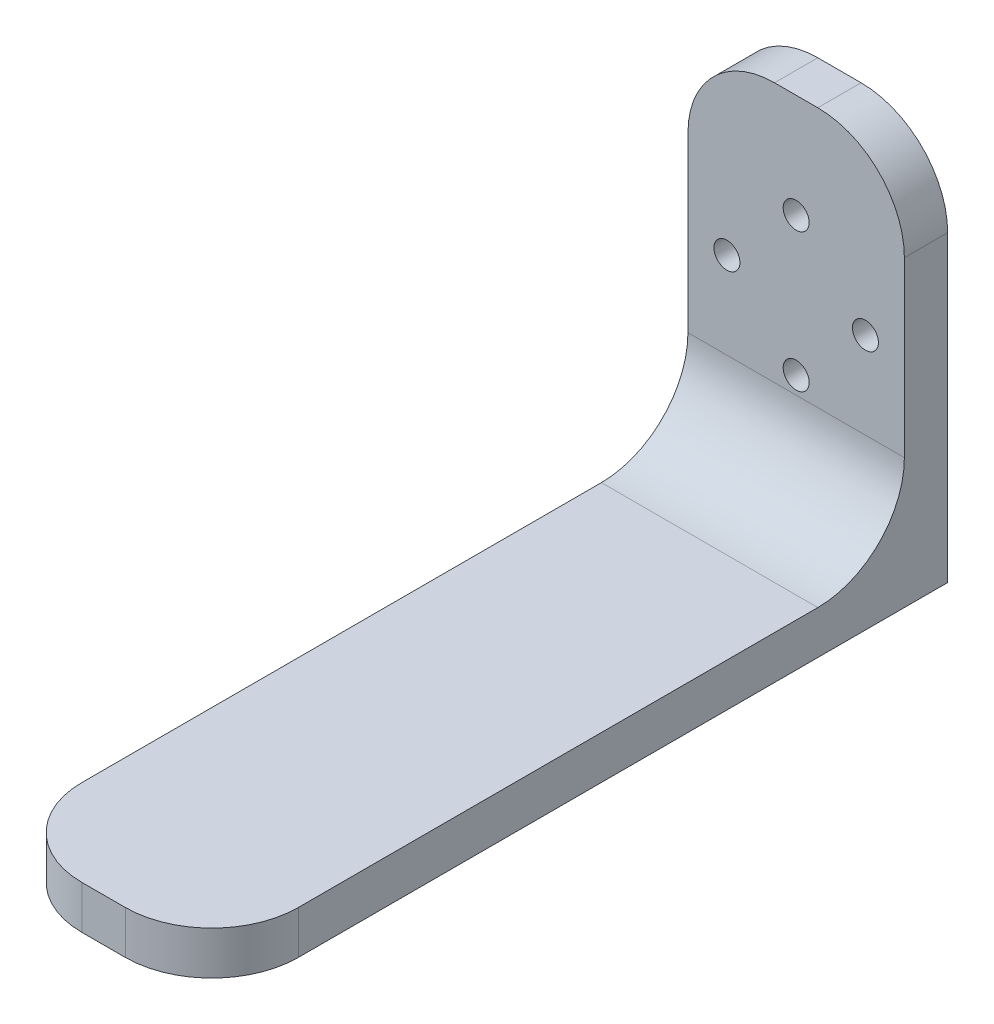
ISO-10303-21;
HEADER;
FILE_DESCRIPTION(('STEP AP214'),'2;1');
FILE_NAME('part.step','',(''),(''),'','','');
FILE_SCHEMA(('AUTOMOTIVE_DESIGN { 1 0 10303 214 1 1 1 1 }'));
ENDSEC;
DATA;
#1=APPLICATION_CONTEXT('core data for automotive mechanical design processes');
#2=APPLICATION_PROTOCOL_DEFINITION('international standard','automotive_design',2000,#1);
#3=PRODUCT_CONTEXT('',#1,'mechanical');
#4=PRODUCT('Part','Part','',(#3));
#5=PRODUCT_RELATED_PRODUCT_CATEGORY('part','',(#4));
#6=PRODUCT_DEFINITION_FORMATION('','',#4);
#7=PRODUCT_DEFINITION_CONTEXT('part definition',#1,'design');
#8=PRODUCT_DEFINITION('design','',#6,#7);
#9=PRODUCT_DEFINITION_SHAPE('','',#8);
#10=(LENGTH_UNIT() NAMED_UNIT(*) SI_UNIT(.MILLI.,.METRE.));
#11=(NAMED_UNIT(*) PLANE_ANGLE_UNIT() SI_UNIT($,.RADIAN.));
#12=(NAMED_UNIT(*) SI_UNIT($,.STERADIAN.) SOLID_ANGLE_UNIT());
#13=UNCERTAINTY_MEASURE_WITH_UNIT(LENGTH_MEASURE(1.E-05),#10,'distance_accuracy_value','');
#14=(GEOMETRIC_REPRESENTATION_CONTEXT(3) GLOBAL_UNCERTAINTY_ASSIGNED_CONTEXT((#13)) GLOBAL_UNIT_ASSIGNED_CONTEXT((#10,
#11,#12)) REPRESENTATION_CONTEXT('',''));
#15=CARTESIAN_POINT('',(0.,0.,0.));
#16=DIRECTION('',(0.,0.,1.));
#17=DIRECTION('',(1.,0.,0.));
#18=AXIS2_PLACEMENT_3D('',#15,#16,#17);
#19=CARTESIAN_POINT('',(0.,0.,5.));
#20=DIRECTION('',(0.,0.,1.));
#21=DIRECTION('',(1.,0.,0.));
#22=AXIS2_PLACEMENT_3D('',#19,#20,#21);
#23=PLANE('',#22);
#24=CARTESIAN_POINT('',(4.50480562578407E-13,-8.,5.));
#25=DIRECTION('',(0.,0.,1.));
#26=DIRECTION('',(1.,0.,0.));
#27=AXIS2_PLACEMENT_3D('',#24,#25,#26);
#28=CIRCLE('',#27,1.50000000000048);
#29=CARTESIAN_POINT('',(1.50000000000093,-8.,5.));
#30=VERTEX_POINT('',#29);
#31=EDGE_CURVE('E163',#30,#30,#28,.T.);
#32=ORIENTED_EDGE('',*,*,#31,.F.);
#33=EDGE_LOOP('',(#32));
#34=FACE_BOUND('',#33,.T.);
#35=CARTESIAN_POINT('',(0.,8.,5.));
#36=DIRECTION('',(0.,0.,1.));
#37=DIRECTION('',(1.,0.,0.));
#38=AXIS2_PLACEMENT_3D('',#35,#36,#37);
#39=CIRCLE('',#38,1.5);
#40=CARTESIAN_POINT('',(1.5,8.,5.));
#41=VERTEX_POINT('',#40);
#42=EDGE_CURVE('E137',#41,#41,#39,.T.);
#43=ORIENTED_EDGE('',*,*,#42,.F.);
#44=EDGE_LOOP('',(#43));
#45=FACE_BOUND('',#44,.T.);
#46=DIRECTION('',(0.,1.,0.));
#47=VECTOR('',#46,1.);
#48=CARTESIAN_POINT('',(12.5,-20.,5.));
#49=LINE('',#48,#47);
#50=CARTESIAN_POINT('',(12.5,-10.,5.));
#51=VERTEX_POINT('',#50);
#52=CARTESIAN_POINT('',(12.5,9.99999999999999,5.));
#53=VERTEX_POINT('',#52);
#54=EDGE_CURVE('E182',#51,#53,#49,.T.);
#55=ORIENTED_EDGE('',*,*,#54,.T.);
#56=CARTESIAN_POINT('',(2.5,10.,5.));
#57=DIRECTION('',(0.,0.,1.));
#58=DIRECTION('',(1.,0.,0.));
#59=AXIS2_PLACEMENT_3D('',#56,#57,#58);
#60=CIRCLE('',#59,10.);
#61=CARTESIAN_POINT('',(2.5,20.,5.));
#62=VERTEX_POINT('',#61);
#63=EDGE_CURVE('E210',#53,#62,#60,.T.);
#64=ORIENTED_EDGE('',*,*,#63,.T.);
#65=DIRECTION('',(-1.,0.,0.));
#66=VECTOR('',#65,1.);
#67=CARTESIAN_POINT('',(12.5,20.,5.));
#68=LINE('',#67,#66);
#69=CARTESIAN_POINT('',(-2.5,20.,5.));
#70=VERTEX_POINT('',#69);
#71=EDGE_CURVE('E186',#62,#70,#68,.T.);
#72=ORIENTED_EDGE('',*,*,#71,.T.);
#73=CARTESIAN_POINT('',(-2.5,9.99999999999999,5.));
#74=DIRECTION('',(0.,0.,1.));
#75=DIRECTION('',(1.,0.,0.));
#76=AXIS2_PLACEMENT_3D('',#73,#74,#75);
#77=CIRCLE('',#76,10.);
#78=CARTESIAN_POINT('',(-12.5,9.99999999999999,5.));
#79=VERTEX_POINT('',#78);
#80=EDGE_CURVE('E208',#70,#79,#77,.T.);
#81=ORIENTED_EDGE('',*,*,#80,.T.);
#82=DIRECTION('',(0.,-1.,0.));
#83=VECTOR('',#82,1.);
#84=CARTESIAN_POINT('',(-12.5,-20.,5.));
#85=LINE('',#84,#83);
#86=CARTESIAN_POINT('',(-12.5,-10.,5.));
#87=VERTEX_POINT('',#86);
#88=EDGE_CURVE('E179',#79,#87,#85,.T.);
#89=ORIENTED_EDGE('',*,*,#88,.T.);
#90=DIRECTION('',(1.,0.,0.));
#91=VECTOR('',#90,1.);
#92=CARTESIAN_POINT('',(12.5,-10.,5.));
#93=LINE('',#92,#91);
#94=EDGE_CURVE('E205',#87,#51,#93,.T.);
#95=ORIENTED_EDGE('',*,*,#94,.T.);
#96=EDGE_LOOP('',(#55,#64,#72,#81,#89,#95));
#97=FACE_BOUND('',#96,.T.);
#98=CARTESIAN_POINT('',(8.,0.,5.));
#99=DIRECTION('',(0.,0.,1.));
#100=DIRECTION('',(1.,0.,0.));
#101=AXIS2_PLACEMENT_3D('',#98,#99,#100);
#102=CIRCLE('',#101,1.5);
#103=CARTESIAN_POINT('',(9.5,0.,5.));
#104=VERTEX_POINT('',#103);
#105=EDGE_CURVE('E169',#104,#104,#102,.T.);
#106=ORIENTED_EDGE('',*,*,#105,.F.);
#107=EDGE_LOOP('',(#106));
#108=FACE_BOUND('',#107,.T.);
#109=CARTESIAN_POINT('',(-7.99999999999977,-2.25828254681354E-13,5.));
#110=DIRECTION('',(0.,0.,1.));
#111=DIRECTION('',(1.,0.,0.));
#112=AXIS2_PLACEMENT_3D('',#109,#110,#111);
#113=CIRCLE('',#112,1.50000000000036);
#114=CARTESIAN_POINT('',(-6.49999999999941,-2.25828254681354E-13,5.));
#115=VERTEX_POINT('',#114);
#116=EDGE_CURVE('E157',#115,#115,#113,.T.);
#117=ORIENTED_EDGE('',*,*,#116,.F.);
#118=EDGE_LOOP('',(#117));
#119=FACE_BOUND('',#118,.T.);
#120=ADVANCED_FACE('F32',(#34,#45,#97,#108,#119),#23,.T.);
#121=CARTESIAN_POINT('',(0.,0.,0.));
#122=DIRECTION('',(0.,0.,1.));
#123=DIRECTION('',(1.,0.,0.));
#124=AXIS2_PLACEMENT_3D('',#121,#122,#123);
#125=PLANE('',#124);
#126=DIRECTION('',(-1.,0.,0.));
#127=VECTOR('',#126,1.);
#128=CARTESIAN_POINT('',(12.5,20.,0.));
#129=LINE('',#128,#127);
#130=CARTESIAN_POINT('',(2.5,20.,0.));
#131=VERTEX_POINT('',#130);
#132=CARTESIAN_POINT('',(-2.5,20.,0.));
#133=VERTEX_POINT('',#132);
#134=EDGE_CURVE('E183',#131,#133,#129,.T.);
#135=ORIENTED_EDGE('',*,*,#134,.F.);
#136=CARTESIAN_POINT('',(2.5,10.,0.));
#137=DIRECTION('',(0.,0.,1.));
#138=DIRECTION('',(1.,0.,0.));
#139=AXIS2_PLACEMENT_3D('',#136,#137,#138);
#140=CIRCLE('',#139,10.);
#141=CARTESIAN_POINT('',(12.5,9.99999999999999,0.));
#142=VERTEX_POINT('',#141);
#143=EDGE_CURVE('E199',#131,#142,#140,.F.);
#144=ORIENTED_EDGE('',*,*,#143,.T.);
#145=DIRECTION('',(0.,1.,0.));
#146=VECTOR('',#145,1.);
#147=CARTESIAN_POINT('',(12.5,-20.,0.));
#148=LINE('',#147,#146);
#149=CARTESIAN_POINT('',(12.5,-25.,0.));
#150=VERTEX_POINT('',#149);
#151=EDGE_CURVE('E136',#150,#142,#148,.T.);
#152=ORIENTED_EDGE('',*,*,#151,.F.);
#153=DIRECTION('',(1.,0.,0.));
#154=VECTOR('',#153,1.);
#155=CARTESIAN_POINT('',(-12.5,-25.,0.));
#156=LINE('',#155,#154);
#157=CARTESIAN_POINT('',(-12.5,-25.,0.));
#158=VERTEX_POINT('',#157);
#159=EDGE_CURVE('E119',#158,#150,#156,.T.);
#160=ORIENTED_EDGE('',*,*,#159,.F.);
#161=DIRECTION('',(0.,-1.,0.));
#162=VECTOR('',#161,1.);
#163=CARTESIAN_POINT('',(-12.5,-20.,0.));
#164=LINE('',#163,#162);
#165=CARTESIAN_POINT('',(-12.5,9.99999999999999,0.));
#166=VERTEX_POINT('',#165);
#167=EDGE_CURVE('E130',#166,#158,#164,.T.);
#168=ORIENTED_EDGE('',*,*,#167,.F.);
#169=CARTESIAN_POINT('',(-2.5,9.99999999999999,0.));
#170=DIRECTION('',(0.,0.,1.));
#171=DIRECTION('',(1.,0.,0.));
#172=AXIS2_PLACEMENT_3D('',#169,#170,#171);
#173=CIRCLE('',#172,10.);
#174=EDGE_CURVE('E197',#166,#133,#173,.F.);
#175=ORIENTED_EDGE('',*,*,#174,.T.);
#176=EDGE_LOOP('',(#135,#144,#152,#160,#168,#175));
#177=FACE_BOUND('',#176,.T.);
#178=CARTESIAN_POINT('',(0.,8.,0.));
#179=DIRECTION('',(0.,0.,1.));
#180=DIRECTION('',(1.,0.,0.));
#181=AXIS2_PLACEMENT_3D('',#178,#179,#180);
#182=CIRCLE('',#181,1.5);
#183=CARTESIAN_POINT('',(1.5,8.,0.));
#184=VERTEX_POINT('',#183);
#185=EDGE_CURVE('E172',#184,#184,#182,.T.);
#186=ORIENTED_EDGE('',*,*,#185,.T.);
#187=EDGE_LOOP('',(#186));
#188=FACE_BOUND('',#187,.T.);
#189=CARTESIAN_POINT('',(8.,0.,0.));
#190=DIRECTION('',(0.,0.,1.));
#191=DIRECTION('',(1.,0.,0.));
#192=AXIS2_PLACEMENT_3D('',#189,#190,#191);
#193=CIRCLE('',#192,1.5);
#194=CARTESIAN_POINT('',(9.5,0.,0.));
#195=VERTEX_POINT('',#194);
#196=EDGE_CURVE('E166',#195,#195,#193,.T.);
#197=ORIENTED_EDGE('',*,*,#196,.T.);
#198=EDGE_LOOP('',(#197));
#199=FACE_BOUND('',#198,.T.);
#200=CARTESIAN_POINT('',(4.50480562578407E-13,-8.,0.));
#201=DIRECTION('',(0.,0.,1.));
#202=DIRECTION('',(1.,0.,0.));
#203=AXIS2_PLACEMENT_3D('',#200,#201,#202);
#204=CIRCLE('',#203,1.50000000000048);
#205=CARTESIAN_POINT('',(1.50000000000093,-8.,0.));
#206=VERTEX_POINT('',#205);
#207=EDGE_CURVE('E160',#206,#206,#204,.T.);
#208=ORIENTED_EDGE('',*,*,#207,.T.);
#209=EDGE_LOOP('',(#208));
#210=FACE_BOUND('',#209,.T.);
#211=CARTESIAN_POINT('',(-7.99999999999977,-2.25828254681354E-13,0.));
#212=DIRECTION('',(0.,0.,1.));
#213=DIRECTION('',(1.,0.,0.));
#214=AXIS2_PLACEMENT_3D('',#211,#212,#213);
#215=CIRCLE('',#214,1.50000000000036);
#216=CARTESIAN_POINT('',(-6.49999999999941,-2.25828254681354E-13,0.));
#217=VERTEX_POINT('',#216);
#218=EDGE_CURVE('E149',#217,#217,#215,.T.);
#219=ORIENTED_EDGE('',*,*,#218,.T.);
#220=EDGE_LOOP('',(#219));
#221=FACE_BOUND('',#220,.T.);
#222=ADVANCED_FACE('F140',(#177,#188,#199,#210,#221),#125,.F.);
#223=CARTESIAN_POINT('',(-12.5,-20.,5.));
#224=DIRECTION('',(1.,0.,0.));
#225=DIRECTION('',(0.,0.,-1.));
#226=AXIS2_PLACEMENT_3D('',#223,#224,#225);
#227=PLANE('',#226);
#228=ORIENTED_EDGE('',*,*,#88,.F.);
#229=DIRECTION('',(0.,0.,-1.));
#230=VECTOR('',#229,1.);
#231=CARTESIAN_POINT('',(-12.5,9.99999999999999,5.));
#232=LINE('',#231,#230);
#233=EDGE_CURVE('E134',#79,#166,#232,.T.);
#234=ORIENTED_EDGE('',*,*,#233,.T.);
#235=ORIENTED_EDGE('',*,*,#167,.T.);
#236=DIRECTION('',(0.,0.,-1.));
#237=VECTOR('',#236,1.);
#238=CARTESIAN_POINT('',(-12.5,-25.,0.));
#239=LINE('',#238,#237);
#240=CARTESIAN_POINT('',(-12.5,-25.,75.));
#241=VERTEX_POINT('',#240);
#242=EDGE_CURVE('E115',#241,#158,#239,.T.);
#243=ORIENTED_EDGE('',*,*,#242,.F.);
#244=DIRECTION('',(0.,1.,0.));
#245=VECTOR('',#244,1.);
#246=CARTESIAN_POINT('',(-12.5,-20.,75.));
#247=LINE('',#246,#245);
#248=CARTESIAN_POINT('',(-12.5,-20.,75.));
#249=VERTEX_POINT('',#248);
#250=EDGE_CURVE('E212',#241,#249,#247,.T.);
#251=ORIENTED_EDGE('',*,*,#250,.T.);
#252=DIRECTION('',(0.,0.,-1.));
#253=VECTOR('',#252,1.);
#254=CARTESIAN_POINT('',(-12.5,-20.,0.));
#255=LINE('',#254,#253);
#256=CARTESIAN_POINT('',(-12.5,-20.,15.));
#257=VERTEX_POINT('',#256);
#258=EDGE_CURVE('E150',#249,#257,#255,.T.);
#259=ORIENTED_EDGE('',*,*,#258,.T.);
#260=CARTESIAN_POINT('',(-12.5,-10.,15.));
#261=DIRECTION('',(1.,0.,0.));
#262=DIRECTION('',(0.,0.,-1.));
#263=AXIS2_PLACEMENT_3D('',#260,#261,#262);
#264=CIRCLE('',#263,10.);
#265=EDGE_CURVE('E11',#257,#87,#264,.T.);
#266=ORIENTED_EDGE('',*,*,#265,.T.);
#267=EDGE_LOOP('',(#228,#234,#235,#243,#251,#259,#266));
#268=FACE_BOUND('',#267,.T.);
#269=ADVANCED_FACE('F132',(#268),#227,.F.);
#270=CARTESIAN_POINT('',(12.5,-20.,5.));
#271=DIRECTION('',(-1.,0.,0.));
#272=DIRECTION('',(0.,0.,1.));
#273=AXIS2_PLACEMENT_3D('',#270,#271,#272);
#274=PLANE('',#273);
#275=ORIENTED_EDGE('',*,*,#151,.T.);
#276=DIRECTION('',(0.,0.,-1.));
#277=VECTOR('',#276,1.);
#278=CARTESIAN_POINT('',(12.5,9.99999999999999,5.));
#279=LINE('',#278,#277);
#280=EDGE_CURVE('E203',#142,#53,#279,.F.);
#281=ORIENTED_EDGE('',*,*,#280,.T.);
#282=ORIENTED_EDGE('',*,*,#54,.F.);
#283=CARTESIAN_POINT('',(12.5,-10.,15.));
#284=DIRECTION('',(-1.,0.,0.));
#285=DIRECTION('',(0.,0.,1.));
#286=AXIS2_PLACEMENT_3D('',#283,#284,#285);
#287=CIRCLE('',#286,10.);
#288=CARTESIAN_POINT('',(12.5,-20.,15.));
#289=VERTEX_POINT('',#288);
#290=EDGE_CURVE('E40',#51,#289,#287,.T.);
#291=ORIENTED_EDGE('',*,*,#290,.T.);
#292=DIRECTION('',(0.,0.,1.));
#293=VECTOR('',#292,1.);
#294=CARTESIAN_POINT('',(12.5,-20.,0.));
#295=LINE('',#294,#293);
#296=CARTESIAN_POINT('',(12.5,-20.,75.));
#297=VERTEX_POINT('',#296);
#298=EDGE_CURVE('E153',#289,#297,#295,.T.);
#299=ORIENTED_EDGE('',*,*,#298,.T.);
#300=DIRECTION('',(0.,1.,0.));
#301=VECTOR('',#300,1.);
#302=CARTESIAN_POINT('',(12.5,-20.,75.));
#303=LINE('',#302,#301);
#304=CARTESIAN_POINT('',(12.5,-25.,75.));
#305=VERTEX_POINT('',#304);
#306=EDGE_CURVE('E201',#297,#305,#303,.F.);
#307=ORIENTED_EDGE('',*,*,#306,.T.);
#308=DIRECTION('',(0.,0.,1.));
#309=VECTOR('',#308,1.);
#310=CARTESIAN_POINT('',(12.5,-25.,0.));
#311=LINE('',#310,#309);
#312=EDGE_CURVE('E143',#150,#305,#311,.T.);
#313=ORIENTED_EDGE('',*,*,#312,.F.);
#314=EDGE_LOOP('',(#275,#281,#282,#291,#299,#307,#313));
#315=FACE_BOUND('',#314,.T.);
#316=ADVANCED_FACE('F229',(#315),#274,.F.);
#317=CARTESIAN_POINT('',(12.5,20.,5.));
#318=DIRECTION('',(0.,-1.,0.));
#319=DIRECTION('',(0.,0.,-1.));
#320=AXIS2_PLACEMENT_3D('',#317,#318,#319);
#321=PLANE('',#320);
#322=ORIENTED_EDGE('',*,*,#71,.F.);
#323=DIRECTION('',(0.,0.,-1.));
#324=VECTOR('',#323,1.);
#325=CARTESIAN_POINT('',(2.5,20.,5.));
#326=LINE('',#325,#324);
#327=EDGE_CURVE('E194',#62,#131,#326,.T.);
#328=ORIENTED_EDGE('',*,*,#327,.T.);
#329=ORIENTED_EDGE('',*,*,#134,.T.);
#330=DIRECTION('',(0.,0.,-1.));
#331=VECTOR('',#330,1.);
#332=CARTESIAN_POINT('',(-2.5,20.,5.));
#333=LINE('',#332,#331);
#334=EDGE_CURVE('E188',#133,#70,#333,.F.);
#335=ORIENTED_EDGE('',*,*,#334,.T.);
#336=EDGE_LOOP('',(#322,#328,#329,#335));
#337=FACE_BOUND('',#336,.T.);
#338=ADVANCED_FACE('F247',(#337),#321,.F.);
#339=CARTESIAN_POINT('',(0.,8.,5.));
#340=DIRECTION('',(0.,0.,-1.));
#341=DIRECTION('',(-1.,0.,0.));
#342=AXIS2_PLACEMENT_3D('',#339,#340,#341);
#343=CYLINDRICAL_SURFACE('',#342,1.5);
#344=ORIENTED_EDGE('',*,*,#42,.T.);
#345=EDGE_LOOP('',(#344));
#346=FACE_BOUND('',#345,.T.);
#347=ORIENTED_EDGE('',*,*,#185,.F.);
#348=EDGE_LOOP('',(#347));
#349=FACE_BOUND('',#348,.T.);
#350=ADVANCED_FACE('F275',(#346,#349),#343,.F.);
#351=CARTESIAN_POINT('',(8.,0.,5.));
#352=DIRECTION('',(0.,0.,-1.));
#353=DIRECTION('',(-1.,0.,0.));
#354=AXIS2_PLACEMENT_3D('',#351,#352,#353);
#355=CYLINDRICAL_SURFACE('',#354,1.5);
#356=ORIENTED_EDGE('',*,*,#105,.T.);
#357=EDGE_LOOP('',(#356));
#358=FACE_BOUND('',#357,.T.);
#359=ORIENTED_EDGE('',*,*,#196,.F.);
#360=EDGE_LOOP('',(#359));
#361=FACE_BOUND('',#360,.T.);
#362=ADVANCED_FACE('F379',(#358,#361),#355,.F.);
#363=CARTESIAN_POINT('',(4.50480562578407E-13,-8.,5.));
#364=DIRECTION('',(0.,0.,-1.));
#365=DIRECTION('',(-1.,0.,0.));
#366=AXIS2_PLACEMENT_3D('',#363,#364,#365);
#367=CYLINDRICAL_SURFACE('',#366,1.50000000000048);
#368=ORIENTED_EDGE('',*,*,#31,.T.);
#369=EDGE_LOOP('',(#368));
#370=FACE_BOUND('',#369,.T.);
#371=ORIENTED_EDGE('',*,*,#207,.F.);
#372=EDGE_LOOP('',(#371));
#373=FACE_BOUND('',#372,.T.);
#374=ADVANCED_FACE('F370',(#370,#373),#367,.F.);
#375=CARTESIAN_POINT('',(-7.99999999999977,-2.25828254681354E-13,5.));
#376=DIRECTION('',(0.,0.,-1.));
#377=DIRECTION('',(-1.,0.,0.));
#378=AXIS2_PLACEMENT_3D('',#375,#376,#377);
#379=CYLINDRICAL_SURFACE('',#378,1.50000000000036);
#380=ORIENTED_EDGE('',*,*,#116,.T.);
#381=EDGE_LOOP('',(#380));
#382=FACE_BOUND('',#381,.T.);
#383=ORIENTED_EDGE('',*,*,#218,.F.);
#384=EDGE_LOOP('',(#383));
#385=FACE_BOUND('',#384,.T.);
#386=ADVANCED_FACE('F335',(#382,#385),#379,.F.);
#387=CARTESIAN_POINT('',(0.,-20.,0.));
#388=DIRECTION('',(0.,1.,0.));
#389=DIRECTION('',(0.,0.,1.));
#390=AXIS2_PLACEMENT_3D('',#387,#388,#389);
#391=PLANE('',#390);
#392=DIRECTION('',(-1.,0.,0.));
#393=VECTOR('',#392,1.);
#394=CARTESIAN_POINT('',(-12.5,-20.,85.));
#395=LINE('',#394,#393);
#396=CARTESIAN_POINT('',(2.5,-20.,85.));
#397=VERTEX_POINT('',#396);
#398=CARTESIAN_POINT('',(-2.5,-20.,85.));
#399=VERTEX_POINT('',#398);
#400=EDGE_CURVE('E126',#397,#399,#395,.T.);
#401=ORIENTED_EDGE('',*,*,#400,.F.);
#402=CARTESIAN_POINT('',(2.5,-20.,75.));
#403=DIRECTION('',(0.,1.,0.));
#404=DIRECTION('',(0.,0.,1.));
#405=AXIS2_PLACEMENT_3D('',#402,#403,#404);
#406=CIRCLE('',#405,10.);
#407=EDGE_CURVE('E223',#397,#297,#406,.T.);
#408=ORIENTED_EDGE('',*,*,#407,.T.);
#409=ORIENTED_EDGE('',*,*,#298,.F.);
#410=DIRECTION('',(1.,0.,0.));
#411=VECTOR('',#410,1.);
#412=CARTESIAN_POINT('',(-12.5,-20.,15.));
#413=LINE('',#412,#411);
#414=EDGE_CURVE('E219',#289,#257,#413,.F.);
#415=ORIENTED_EDGE('',*,*,#414,.T.);
#416=ORIENTED_EDGE('',*,*,#258,.F.);
#417=CARTESIAN_POINT('',(-2.5,-20.,75.));
#418=DIRECTION('',(0.,1.,0.));
#419=DIRECTION('',(0.,0.,1.));
#420=AXIS2_PLACEMENT_3D('',#417,#418,#419);
#421=CIRCLE('',#420,10.);
#422=EDGE_CURVE('E221',#249,#399,#421,.T.);
#423=ORIENTED_EDGE('',*,*,#422,.T.);
#424=EDGE_LOOP('',(#401,#408,#409,#415,#416,#423));
#425=FACE_BOUND('',#424,.T.);
#426=ADVANCED_FACE('F236',(#425),#391,.T.);
#427=CARTESIAN_POINT('',(-12.5,-25.,85.));
#428=DIRECTION('',(0.,0.,-1.));
#429=DIRECTION('',(-1.,0.,0.));
#430=AXIS2_PLACEMENT_3D('',#427,#428,#429);
#431=PLANE('',#430);
#432=DIRECTION('',(-1.,0.,0.));
#433=VECTOR('',#432,1.);
#434=CARTESIAN_POINT('',(-12.5,-25.,85.));
#435=LINE('',#434,#433);
#436=CARTESIAN_POINT('',(2.5,-25.,85.));
#437=VERTEX_POINT('',#436);
#438=CARTESIAN_POINT('',(-2.5,-25.,85.));
#439=VERTEX_POINT('',#438);
#440=EDGE_CURVE('E145',#437,#439,#435,.T.);
#441=ORIENTED_EDGE('',*,*,#440,.F.);
#442=DIRECTION('',(0.,1.,0.));
#443=VECTOR('',#442,1.);
#444=CARTESIAN_POINT('',(2.5,-25.,85.));
#445=LINE('',#444,#443);
#446=EDGE_CURVE('E216',#437,#397,#445,.T.);
#447=ORIENTED_EDGE('',*,*,#446,.T.);
#448=ORIENTED_EDGE('',*,*,#400,.T.);
#449=DIRECTION('',(0.,1.,0.));
#450=VECTOR('',#449,1.);
#451=CARTESIAN_POINT('',(-2.5,-25.,85.));
#452=LINE('',#451,#450);
#453=EDGE_CURVE('E47',#399,#439,#452,.F.);
#454=ORIENTED_EDGE('',*,*,#453,.T.);
#455=EDGE_LOOP('',(#441,#447,#448,#454));
#456=FACE_BOUND('',#455,.T.);
#457=ADVANCED_FACE('F256',(#456),#431,.F.);
#458=CARTESIAN_POINT('',(0.,-25.,0.));
#459=DIRECTION('',(0.,1.,0.));
#460=DIRECTION('',(0.,0.,1.));
#461=AXIS2_PLACEMENT_3D('',#458,#459,#460);
#462=PLANE('',#461);
#463=ORIENTED_EDGE('',*,*,#312,.T.);
#464=CARTESIAN_POINT('',(2.5,-25.,75.));
#465=DIRECTION('',(0.,1.,0.));
#466=DIRECTION('',(0.,0.,1.));
#467=AXIS2_PLACEMENT_3D('',#464,#465,#466);
#468=CIRCLE('',#467,10.);
#469=EDGE_CURVE('E54',#305,#437,#468,.F.);
#470=ORIENTED_EDGE('',*,*,#469,.T.);
#471=ORIENTED_EDGE('',*,*,#440,.T.);
#472=CARTESIAN_POINT('',(-2.5,-25.,75.));
#473=DIRECTION('',(0.,1.,0.));
#474=DIRECTION('',(0.,0.,1.));
#475=AXIS2_PLACEMENT_3D('',#472,#473,#474);
#476=CIRCLE('',#475,10.);
#477=EDGE_CURVE('E122',#439,#241,#476,.F.);
#478=ORIENTED_EDGE('',*,*,#477,.T.);
#479=ORIENTED_EDGE('',*,*,#242,.T.);
#480=ORIENTED_EDGE('',*,*,#159,.T.);
#481=EDGE_LOOP('',(#463,#470,#471,#478,#479,#480));
#482=FACE_BOUND('',#481,.T.);
#483=ADVANCED_FACE('F117',(#482),#462,.F.);
#484=CARTESIAN_POINT('',(2.5,10.,5.));
#485=DIRECTION('',(0.,0.,-1.));
#486=DIRECTION('',(-1.,0.,0.));
#487=AXIS2_PLACEMENT_3D('',#484,#485,#486);
#488=CYLINDRICAL_SURFACE('',#487,10.);
#489=ORIENTED_EDGE('',*,*,#63,.F.);
#490=ORIENTED_EDGE('',*,*,#280,.F.);
#491=ORIENTED_EDGE('',*,*,#143,.F.);
#492=ORIENTED_EDGE('',*,*,#327,.F.);
#493=EDGE_LOOP('',(#489,#490,#491,#492));
#494=FACE_BOUND('',#493,.T.);
#495=ADVANCED_FACE('F251',(#494),#488,.T.);
#496=CARTESIAN_POINT('',(-2.5,9.99999999999999,5.));
#497=DIRECTION('',(0.,0.,-1.));
#498=DIRECTION('',(-1.,0.,0.));
#499=AXIS2_PLACEMENT_3D('',#496,#497,#498);
#500=CYLINDRICAL_SURFACE('',#499,10.);
#501=ORIENTED_EDGE('',*,*,#80,.F.);
#502=ORIENTED_EDGE('',*,*,#334,.F.);
#503=ORIENTED_EDGE('',*,*,#174,.F.);
#504=ORIENTED_EDGE('',*,*,#233,.F.);
#505=EDGE_LOOP('',(#501,#502,#503,#504));
#506=FACE_BOUND('',#505,.T.);
#507=ADVANCED_FACE('F245',(#506),#500,.T.);
#508=CARTESIAN_POINT('',(2.5,-25.,75.));
#509=DIRECTION('',(0.,1.,0.));
#510=DIRECTION('',(0.,0.,1.));
#511=AXIS2_PLACEMENT_3D('',#508,#509,#510);
#512=CYLINDRICAL_SURFACE('',#511,10.);
#513=ORIENTED_EDGE('',*,*,#469,.F.);
#514=ORIENTED_EDGE('',*,*,#306,.F.);
#515=ORIENTED_EDGE('',*,*,#407,.F.);
#516=ORIENTED_EDGE('',*,*,#446,.F.);
#517=EDGE_LOOP('',(#513,#514,#515,#516));
#518=FACE_BOUND('',#517,.T.);
#519=ADVANCED_FACE('F255',(#518),#512,.T.);
#520=CARTESIAN_POINT('',(-2.5,-20.,75.));
#521=DIRECTION('',(0.,1.,0.));
#522=DIRECTION('',(0.,0.,1.));
#523=AXIS2_PLACEMENT_3D('',#520,#521,#522);
#524=CYLINDRICAL_SURFACE('',#523,10.);
#525=ORIENTED_EDGE('',*,*,#477,.F.);
#526=ORIENTED_EDGE('',*,*,#453,.F.);
#527=ORIENTED_EDGE('',*,*,#422,.F.);
#528=ORIENTED_EDGE('',*,*,#250,.F.);
#529=EDGE_LOOP('',(#525,#526,#527,#528));
#530=FACE_BOUND('',#529,.T.);
#531=ADVANCED_FACE('F258',(#530),#524,.T.);
#532=CARTESIAN_POINT('',(0.,-10.,15.));
#533=DIRECTION('',(-1.,0.,0.));
#534=DIRECTION('',(0.,0.,1.));
#535=AXIS2_PLACEMENT_3D('',#532,#533,#534);
#536=CYLINDRICAL_SURFACE('',#535,10.);
#537=ORIENTED_EDGE('',*,*,#265,.F.);
#538=ORIENTED_EDGE('',*,*,#414,.F.);
#539=ORIENTED_EDGE('',*,*,#290,.F.);
#540=ORIENTED_EDGE('',*,*,#94,.F.);
#541=EDGE_LOOP('',(#537,#538,#539,#540));
#542=FACE_BOUND('',#541,.T.);
#543=ADVANCED_FACE('F34',(#542),#536,.F.);
#544=CLOSED_SHELL('',(#120,#222,#269,#316,#338,#350,#362,#374,#386,#426,#457,#483,#495,#507,
#519,#531,#543));
#545=MANIFOLD_SOLID_BREP('B2',#544);
#546=ADVANCED_BREP_SHAPE_REPRESENTATION('',(#18,#545),#14);
#547=SHAPE_DEFINITION_REPRESENTATION(#9,#546);
ENDSEC;
END-ISO-10303-21;
